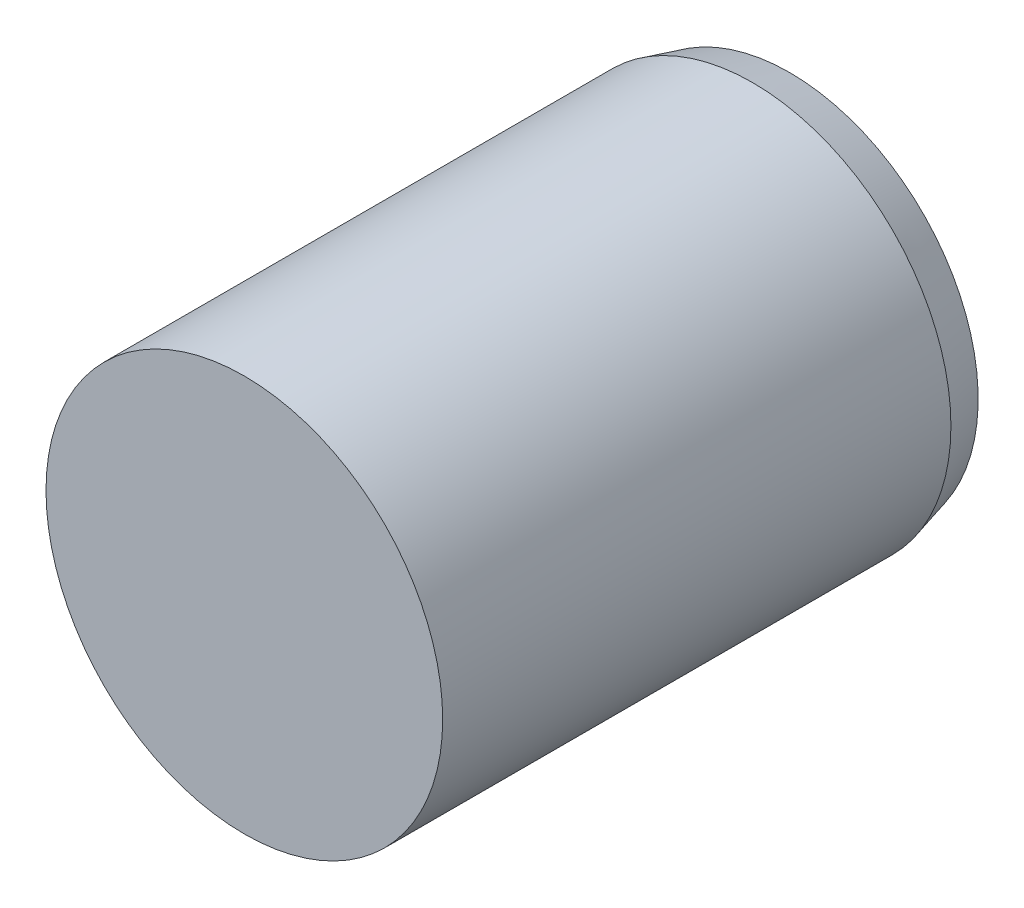
ISO-10303-21;
HEADER;
FILE_DESCRIPTION(('STEP AP214'),'2;1');
FILE_NAME('part.step','',(''),(''),'','','');
FILE_SCHEMA(('AUTOMOTIVE_DESIGN { 1 0 10303 214 1 1 1 1 }'));
ENDSEC;
DATA;
#1=APPLICATION_CONTEXT('core data for automotive mechanical design processes');
#2=APPLICATION_PROTOCOL_DEFINITION('international standard','automotive_design',2000,#1);
#3=PRODUCT_CONTEXT('',#1,'mechanical');
#4=PRODUCT('Part','Part','',(#3));
#5=PRODUCT_RELATED_PRODUCT_CATEGORY('part','',(#4));
#6=PRODUCT_DEFINITION_FORMATION('','',#4);
#7=PRODUCT_DEFINITION_CONTEXT('part definition',#1,'design');
#8=PRODUCT_DEFINITION('design','',#6,#7);
#9=PRODUCT_DEFINITION_SHAPE('','',#8);
#10=(LENGTH_UNIT() NAMED_UNIT(*) SI_UNIT(.MILLI.,.METRE.));
#11=(NAMED_UNIT(*) PLANE_ANGLE_UNIT() SI_UNIT($,.RADIAN.));
#12=(NAMED_UNIT(*) SI_UNIT($,.STERADIAN.) SOLID_ANGLE_UNIT());
#13=UNCERTAINTY_MEASURE_WITH_UNIT(LENGTH_MEASURE(1.E-05),#10,'distance_accuracy_value','');
#14=(GEOMETRIC_REPRESENTATION_CONTEXT(3) GLOBAL_UNCERTAINTY_ASSIGNED_CONTEXT((#13)) GLOBAL_UNIT_ASSIGNED_CONTEXT((#10,
#11,#12)) REPRESENTATION_CONTEXT('',''));
#15=CARTESIAN_POINT('',(0.,0.,0.));
#16=DIRECTION('',(0.,0.,1.));
#17=DIRECTION('',(1.,0.,0.));
#18=AXIS2_PLACEMENT_3D('',#15,#16,#17);
#19=CARTESIAN_POINT('',(0.,0.,6.35));
#20=DIRECTION('',(0.,0.,1.));
#21=DIRECTION('',(0.,-1.,0.));
#22=AXIS2_PLACEMENT_3D('',#19,#20,#21);
#23=CYLINDRICAL_SURFACE('',#22,3.175);
#24=CARTESIAN_POINT('',(0.,0.,-5.7546875));
#25=DIRECTION('',(0.,0.,1.));
#26=DIRECTION('',(0.,-1.,0.));
#27=AXIS2_PLACEMENT_3D('',#24,#25,#26);
#28=CIRCLE('',#27,3.175);
#29=CARTESIAN_POINT('',(0.,-3.175,-5.7546875));
#30=VERTEX_POINT('',#29);
#31=EDGE_CURVE('E12',#30,#30,#28,.T.);
#32=ORIENTED_EDGE('',*,*,#31,.T.);
#33=EDGE_LOOP('',(#32));
#34=FACE_BOUND('',#33,.T.);
#35=CARTESIAN_POINT('',(0.,0.,2.38125));
#36=DIRECTION('',(0.,0.,1.));
#37=DIRECTION('',(1.,0.,0.));
#38=AXIS2_PLACEMENT_3D('',#35,#36,#37);
#39=CIRCLE('',#38,3.175);
#40=CARTESIAN_POINT('',(3.175,0.,2.38125));
#41=VERTEX_POINT('',#40);
#42=EDGE_CURVE('E68',#41,#41,#39,.T.);
#43=ORIENTED_EDGE('',*,*,#42,.F.);
#44=EDGE_LOOP('',(#43));
#45=FACE_BOUND('',#44,.T.);
#46=ADVANCED_FACE('F55',(#34,#45),#23,.T.);
#47=CARTESIAN_POINT('',(0.,0.,-6.35));
#48=DIRECTION('',(0.,0.,1.));
#49=DIRECTION('',(0.,-1.,0.));
#50=AXIS2_PLACEMENT_3D('',#47,#48,#49);
#51=CONICAL_SURFACE('',#50,3.01548649638085,0.261799387799142);
#52=ORIENTED_EDGE('',*,*,#31,.F.);
#53=EDGE_LOOP('',(#52));
#54=FACE_BOUND('',#53,.T.);
#55=CARTESIAN_POINT('',(0.,0.,-6.35));
#56=DIRECTION('',(0.,0.,1.));
#57=DIRECTION('',(0.,-1.,0.));
#58=AXIS2_PLACEMENT_3D('',#55,#56,#57);
#59=CIRCLE('',#58,3.01548649638085);
#60=CARTESIAN_POINT('',(0.,-3.01548649638085,-6.35));
#61=VERTEX_POINT('',#60);
#62=EDGE_CURVE('E62',#61,#61,#59,.T.);
#63=ORIENTED_EDGE('',*,*,#62,.T.);
#64=EDGE_LOOP('',(#63));
#65=FACE_BOUND('',#64,.T.);
#66=ADVANCED_FACE('F81',(#54,#65),#51,.T.);
#67=CARTESIAN_POINT('',(0.,0.,-6.35));
#68=DIRECTION('',(0.,0.,1.));
#69=DIRECTION('',(0.,-1.,0.));
#70=AXIS2_PLACEMENT_3D('',#67,#68,#69);
#71=PLANE('',#70);
#72=ORIENTED_EDGE('',*,*,#62,.F.);
#73=EDGE_LOOP('',(#72));
#74=FACE_BOUND('',#73,.T.);
#75=ADVANCED_FACE('F84',(#74),#71,.F.);
#76=CARTESIAN_POINT('',(0.,0.,2.38125));
#77=DIRECTION('',(0.,0.,1.));
#78=DIRECTION('',(1.,0.,0.));
#79=AXIS2_PLACEMENT_3D('',#76,#77,#78);
#80=PLANE('',#79);
#81=ORIENTED_EDGE('',*,*,#42,.T.);
#82=EDGE_LOOP('',(#81));
#83=FACE_BOUND('',#82,.T.);
#84=ADVANCED_FACE('F78',(#83),#80,.T.);
#85=CLOSED_SHELL('',(#46,#66,#75,#84));
#86=MANIFOLD_SOLID_BREP('B2',#85);
#87=ADVANCED_BREP_SHAPE_REPRESENTATION('',(#18,#86),#14);
#88=SHAPE_DEFINITION_REPRESENTATION(#9,#87);
ENDSEC;
END-ISO-10303-21;
